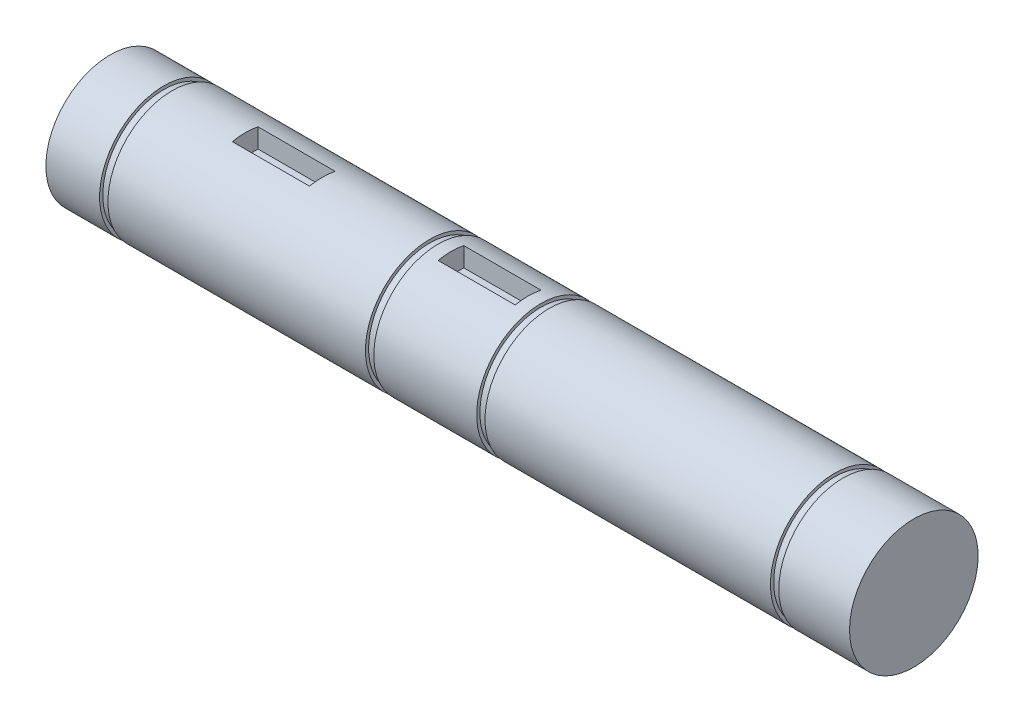
ISO-10303-21;
HEADER;
FILE_DESCRIPTION(('STEP AP214'),'2;1');
FILE_NAME('part.step','',(''),(''),'','','');
FILE_SCHEMA(('AUTOMOTIVE_DESIGN { 1 0 10303 214 1 1 1 1 }'));
ENDSEC;
DATA;
#1=APPLICATION_CONTEXT('core data for automotive mechanical design processes');
#2=APPLICATION_PROTOCOL_DEFINITION('international standard','automotive_design',2000,#1);
#3=PRODUCT_CONTEXT('',#1,'mechanical');
#4=PRODUCT('Part','Part','',(#3));
#5=PRODUCT_RELATED_PRODUCT_CATEGORY('part','',(#4));
#6=PRODUCT_DEFINITION_FORMATION('','',#4);
#7=PRODUCT_DEFINITION_CONTEXT('part definition',#1,'design');
#8=PRODUCT_DEFINITION('design','',#6,#7);
#9=PRODUCT_DEFINITION_SHAPE('','',#8);
#10=(LENGTH_UNIT() NAMED_UNIT(*) SI_UNIT(.MILLI.,.METRE.));
#11=(NAMED_UNIT(*) PLANE_ANGLE_UNIT() SI_UNIT($,.RADIAN.));
#12=(NAMED_UNIT(*) SI_UNIT($,.STERADIAN.) SOLID_ANGLE_UNIT());
#13=UNCERTAINTY_MEASURE_WITH_UNIT(LENGTH_MEASURE(1.E-05),#10,'distance_accuracy_value','');
#14=(GEOMETRIC_REPRESENTATION_CONTEXT(3) GLOBAL_UNCERTAINTY_ASSIGNED_CONTEXT((#13)) GLOBAL_UNIT_ASSIGNED_CONTEXT((#10,
#11,#12)) REPRESENTATION_CONTEXT('',''));
#15=CARTESIAN_POINT('',(0.,0.,0.));
#16=DIRECTION('',(0.,0.,1.));
#17=DIRECTION('',(1.,0.,0.));
#18=AXIS2_PLACEMENT_3D('',#15,#16,#17);
#19=CARTESIAN_POINT('',(77.5,0.,0.));
#20=DIRECTION('',(-1.,0.,0.));
#21=DIRECTION('',(0.,0.,1.));
#22=AXIS2_PLACEMENT_3D('',#19,#20,#21);
#23=CYLINDRICAL_SURFACE('',#22,10.);
#24=CARTESIAN_POINT('',(36.5,0.,0.));
#25=DIRECTION('',(1.,0.,0.));
#26=DIRECTION('',(0.,0.,-1.));
#27=AXIS2_PLACEMENT_3D('',#24,#25,#26);
#28=CIRCLE('',#27,10.);
#29=CARTESIAN_POINT('',(36.5,0.,-10.));
#30=VERTEX_POINT('',#29);
#31=EDGE_CURVE('E266',#30,#30,#28,.T.);
#32=ORIENTED_EDGE('',*,*,#31,.T.);
#33=EDGE_LOOP('',(#32));
#34=FACE_BOUND('',#33,.T.);
#35=CARTESIAN_POINT('',(47.5,0.,0.));
#36=DIRECTION('',(-1.,0.,0.));
#37=DIRECTION('',(0.,0.,1.));
#38=AXIS2_PLACEMENT_3D('',#35,#36,#37);
#39=CIRCLE('',#38,10.);
#40=CARTESIAN_POINT('',(47.5,0.,10.));
#41=VERTEX_POINT('',#40);
#42=EDGE_CURVE('E11',#41,#41,#39,.T.);
#43=ORIENTED_EDGE('',*,*,#42,.T.);
#44=EDGE_LOOP('',(#43));
#45=FACE_BOUND('',#44,.T.);
#46=ADVANCED_FACE('F40',(#34,#45),#23,.T.);
#47=CARTESIAN_POINT('',(35.2,10.,0.));
#48=DIRECTION('',(-1.,0.,0.));
#49=DIRECTION('',(0.,0.,1.));
#50=AXIS2_PLACEMENT_3D('',#47,#48,#49);
#51=PLANE('',#50);
#52=CARTESIAN_POINT('',(35.2,0.,0.));
#53=DIRECTION('',(1.,0.,0.));
#54=DIRECTION('',(0.,0.,-1.));
#55=AXIS2_PLACEMENT_3D('',#52,#53,#54);
#56=CIRCLE('',#55,9.5);
#57=CARTESIAN_POINT('',(35.2,0.,-9.5));
#58=VERTEX_POINT('',#57);
#59=EDGE_CURVE('E294',#58,#58,#56,.T.);
#60=ORIENTED_EDGE('',*,*,#59,.F.);
#61=EDGE_LOOP('',(#60));
#62=FACE_BOUND('',#61,.T.);
#63=CARTESIAN_POINT('',(35.2,0.,0.));
#64=DIRECTION('',(1.,0.,0.));
#65=DIRECTION('',(0.,0.,-1.));
#66=AXIS2_PLACEMENT_3D('',#63,#64,#65);
#67=CIRCLE('',#66,10.);
#68=CARTESIAN_POINT('',(35.2,0.,-10.));
#69=VERTEX_POINT('',#68);
#70=EDGE_CURVE('E263',#69,#69,#67,.T.);
#71=ORIENTED_EDGE('',*,*,#70,.T.);
#72=EDGE_LOOP('',(#71));
#73=FACE_BOUND('',#72,.T.);
#74=ADVANCED_FACE('F197',(#62,#73),#51,.F.);
#75=CARTESIAN_POINT('',(36.5,10.,0.));
#76=DIRECTION('',(1.,0.,0.));
#77=DIRECTION('',(0.,0.,-1.));
#78=AXIS2_PLACEMENT_3D('',#75,#76,#77);
#79=PLANE('',#78);
#80=ORIENTED_EDGE('',*,*,#31,.F.);
#81=EDGE_LOOP('',(#80));
#82=FACE_BOUND('',#81,.T.);
#83=CARTESIAN_POINT('',(36.5,0.,0.));
#84=DIRECTION('',(1.,0.,0.));
#85=DIRECTION('',(0.,0.,-1.));
#86=AXIS2_PLACEMENT_3D('',#83,#84,#85);
#87=CIRCLE('',#86,9.5);
#88=CARTESIAN_POINT('',(36.5,0.,-9.5));
#89=VERTEX_POINT('',#88);
#90=EDGE_CURVE('E271',#89,#89,#87,.T.);
#91=ORIENTED_EDGE('',*,*,#90,.T.);
#92=EDGE_LOOP('',(#91));
#93=FACE_BOUND('',#92,.T.);
#94=ADVANCED_FACE('F204',(#82,#93),#79,.F.);
#95=CARTESIAN_POINT('',(0.,0.,0.));
#96=DIRECTION('',(1.,0.,0.));
#97=DIRECTION('',(0.,0.,-1.));
#98=AXIS2_PLACEMENT_3D('',#95,#96,#97);
#99=CYLINDRICAL_SURFACE('',#98,9.5);
#100=ORIENTED_EDGE('',*,*,#90,.F.);
#101=EDGE_LOOP('',(#100));
#102=FACE_BOUND('',#101,.T.);
#103=ORIENTED_EDGE('',*,*,#59,.T.);
#104=EDGE_LOOP('',(#103));
#105=FACE_BOUND('',#104,.T.);
#106=ADVANCED_FACE('F246',(#102,#105),#99,.T.);
#107=CARTESIAN_POINT('',(-9.20000000000001,0.,0.));
#108=DIRECTION('',(1.,0.,0.));
#109=DIRECTION('',(0.,0.,-1.));
#110=AXIS2_PLACEMENT_3D('',#107,#108,#109);
#111=CIRCLE('',#110,10.);
#112=CARTESIAN_POINT('',(-9.20000000000001,0.,-10.));
#113=VERTEX_POINT('',#112);
#114=EDGE_CURVE('E260',#113,#113,#111,.T.);
#115=ORIENTED_EDGE('',*,*,#114,.T.);
#116=EDGE_LOOP('',(#115));
#117=FACE_BOUND('',#116,.T.);
#118=ORIENTED_EDGE('',*,*,#70,.F.);
#119=EDGE_LOOP('',(#118));
#120=FACE_BOUND('',#119,.T.);
#121=ADVANCED_FACE('F212',(#117,#120),#23,.T.);
#122=CARTESIAN_POINT('',(-9.20000000000001,10.,0.));
#123=DIRECTION('',(1.,0.,0.));
#124=DIRECTION('',(0.,0.,-1.));
#125=AXIS2_PLACEMENT_3D('',#122,#123,#124);
#126=PLANE('',#125);
#127=ORIENTED_EDGE('',*,*,#114,.F.);
#128=EDGE_LOOP('',(#127));
#129=FACE_BOUND('',#128,.T.);
#130=CARTESIAN_POINT('',(-9.20000000000001,0.,0.));
#131=DIRECTION('',(1.,0.,0.));
#132=DIRECTION('',(0.,0.,-1.));
#133=AXIS2_PLACEMENT_3D('',#130,#131,#132);
#134=CIRCLE('',#133,9.5);
#135=CARTESIAN_POINT('',(-9.20000000000001,0.,-9.5));
#136=VERTEX_POINT('',#135);
#137=EDGE_CURVE('E277',#136,#136,#134,.T.);
#138=ORIENTED_EDGE('',*,*,#137,.T.);
#139=EDGE_LOOP('',(#138));
#140=FACE_BOUND('',#139,.T.);
#141=ADVANCED_FACE('F245',(#129,#140),#126,.F.);
#142=CARTESIAN_POINT('',(0.,0.,0.));
#143=DIRECTION('',(1.,0.,0.));
#144=DIRECTION('',(0.,0.,-1.));
#145=AXIS2_PLACEMENT_3D('',#142,#143,#144);
#146=CYLINDRICAL_SURFACE('',#145,9.5);
#147=ORIENTED_EDGE('',*,*,#137,.F.);
#148=EDGE_LOOP('',(#147));
#149=FACE_BOUND('',#148,.T.);
#150=CARTESIAN_POINT('',(-10.5,0.,0.));
#151=DIRECTION('',(1.,0.,0.));
#152=DIRECTION('',(0.,0.,-1.));
#153=AXIS2_PLACEMENT_3D('',#150,#151,#152);
#154=CIRCLE('',#153,9.5);
#155=CARTESIAN_POINT('',(-10.5,0.,-9.5));
#156=VERTEX_POINT('',#155);
#157=EDGE_CURVE('E269',#156,#156,#154,.T.);
#158=ORIENTED_EDGE('',*,*,#157,.T.);
#159=EDGE_LOOP('',(#158));
#160=FACE_BOUND('',#159,.T.);
#161=ADVANCED_FACE('F252',(#149,#160),#146,.T.);
#162=CARTESIAN_POINT('',(-10.5,10.,0.));
#163=DIRECTION('',(-1.,0.,0.));
#164=DIRECTION('',(0.,0.,1.));
#165=AXIS2_PLACEMENT_3D('',#162,#163,#164);
#166=PLANE('',#165);
#167=ORIENTED_EDGE('',*,*,#157,.F.);
#168=EDGE_LOOP('',(#167));
#169=FACE_BOUND('',#168,.T.);
#170=CARTESIAN_POINT('',(-10.5,0.,0.));
#171=DIRECTION('',(1.,0.,0.));
#172=DIRECTION('',(0.,0.,-1.));
#173=AXIS2_PLACEMENT_3D('',#170,#171,#172);
#174=CIRCLE('',#173,10.);
#175=CARTESIAN_POINT('',(-10.5,0.,-10.));
#176=VERTEX_POINT('',#175);
#177=EDGE_CURVE('E265',#176,#176,#174,.T.);
#178=ORIENTED_EDGE('',*,*,#177,.T.);
#179=EDGE_LOOP('',(#178));
#180=FACE_BOUND('',#179,.T.);
#181=ADVANCED_FACE('F337',(#169,#180),#166,.F.);
#182=CARTESIAN_POINT('',(0.,6.8,0.));
#183=DIRECTION('',(0.,-1.,0.));
#184=DIRECTION('',(0.,0.,-1.));
#185=AXIS2_PLACEMENT_3D('',#182,#183,#184);
#186=PLANE('',#185);
#187=DIRECTION('',(0.,0.,-1.));
#188=VECTOR('',#187,1.);
#189=CARTESIAN_POINT('',(-12.5,6.8,2.));
#190=LINE('',#189,#188);
#191=CARTESIAN_POINT('',(-12.5,6.8,2.));
#192=VERTEX_POINT('',#191);
#193=CARTESIAN_POINT('',(-12.5,6.8,-2.));
#194=VERTEX_POINT('',#193);
#195=EDGE_CURVE('E127',#192,#194,#190,.T.);
#196=ORIENTED_EDGE('',*,*,#195,.T.);
#197=DIRECTION('',(-1.,0.,0.));
#198=VECTOR('',#197,1.);
#199=CARTESIAN_POINT('',(-24.5,6.8,-2.));
#200=LINE('',#199,#198);
#201=CARTESIAN_POINT('',(-24.5,6.8,-2.));
#202=VERTEX_POINT('',#201);
#203=EDGE_CURVE('E130',#194,#202,#200,.T.);
#204=ORIENTED_EDGE('',*,*,#203,.T.);
#205=DIRECTION('',(0.,0.,1.));
#206=VECTOR('',#205,1.);
#207=CARTESIAN_POINT('',(-24.5,6.8,2.));
#208=LINE('',#207,#206);
#209=CARTESIAN_POINT('',(-24.5,6.8,2.));
#210=VERTEX_POINT('',#209);
#211=EDGE_CURVE('E158',#202,#210,#208,.T.);
#212=ORIENTED_EDGE('',*,*,#211,.T.);
#213=DIRECTION('',(1.,0.,0.));
#214=VECTOR('',#213,1.);
#215=CARTESIAN_POINT('',(-24.5,6.8,2.));
#216=LINE('',#215,#214);
#217=EDGE_CURVE('E147',#210,#192,#216,.T.);
#218=ORIENTED_EDGE('',*,*,#217,.T.);
#219=EDGE_LOOP('',(#196,#204,#212,#218));
#220=FACE_BOUND('',#219,.T.);
#221=ADVANCED_FACE('F330',(#220),#186,.F.);
#222=CARTESIAN_POINT('',(-12.5,6.8,2.));
#223=DIRECTION('',(1.,0.,0.));
#224=DIRECTION('',(0.,0.,-1.));
#225=AXIS2_PLACEMENT_3D('',#222,#223,#224);
#226=PLANE('',#225);
#227=DIRECTION('',(0.,1.,0.));
#228=VECTOR('',#227,1.);
#229=CARTESIAN_POINT('',(-12.5,6.8,-2.));
#230=LINE('',#229,#228);
#231=CARTESIAN_POINT('',(-12.5,9.79795897113271,-2.));
#232=VERTEX_POINT('',#231);
#233=EDGE_CURVE('E145',#194,#232,#230,.T.);
#234=ORIENTED_EDGE('',*,*,#233,.F.);
#235=ORIENTED_EDGE('',*,*,#195,.F.);
#236=DIRECTION('',(0.,1.,0.));
#237=VECTOR('',#236,1.);
#238=CARTESIAN_POINT('',(-12.5,6.8,2.));
#239=LINE('',#238,#237);
#240=CARTESIAN_POINT('',(-12.5,9.79795897113271,2.));
#241=VERTEX_POINT('',#240);
#242=EDGE_CURVE('E154',#192,#241,#239,.T.);
#243=ORIENTED_EDGE('',*,*,#242,.T.);
#244=CARTESIAN_POINT('',(-12.5,0.,0.));
#245=DIRECTION('',(1.,0.,0.));
#246=DIRECTION('',(0.,0.,-1.));
#247=AXIS2_PLACEMENT_3D('',#244,#245,#246);
#248=CIRCLE('',#247,10.);
#249=EDGE_CURVE('E63',#232,#241,#248,.T.);
#250=ORIENTED_EDGE('',*,*,#249,.F.);
#251=EDGE_LOOP('',(#234,#235,#243,#250));
#252=FACE_BOUND('',#251,.T.);
#253=ADVANCED_FACE('F326',(#252),#226,.F.);
#254=CARTESIAN_POINT('',(-24.5,6.8,-2.));
#255=DIRECTION('',(0.,0.,-1.));
#256=DIRECTION('',(-1.,0.,0.));
#257=AXIS2_PLACEMENT_3D('',#254,#255,#256);
#258=PLANE('',#257);
#259=DIRECTION('',(0.,1.,0.));
#260=VECTOR('',#259,1.);
#261=CARTESIAN_POINT('',(-24.5,6.8,-2.));
#262=LINE('',#261,#260);
#263=CARTESIAN_POINT('',(-24.5,9.79795897113271,-2.));
#264=VERTEX_POINT('',#263);
#265=EDGE_CURVE('E148',#202,#264,#262,.T.);
#266=ORIENTED_EDGE('',*,*,#265,.F.);
#267=ORIENTED_EDGE('',*,*,#203,.F.);
#268=ORIENTED_EDGE('',*,*,#233,.T.);
#269=DIRECTION('',(-1.,0.,0.));
#270=VECTOR('',#269,1.);
#271=CARTESIAN_POINT('',(77.5,9.79795897113271,-2.));
#272=LINE('',#271,#270);
#273=EDGE_CURVE('E169',#264,#232,#272,.F.);
#274=ORIENTED_EDGE('',*,*,#273,.F.);
#275=EDGE_LOOP('',(#266,#267,#268,#274));
#276=FACE_BOUND('',#275,.T.);
#277=ADVANCED_FACE('F329',(#276),#258,.F.);
#278=CARTESIAN_POINT('',(-24.5,6.8,2.));
#279=DIRECTION('',(-1.,0.,0.));
#280=DIRECTION('',(0.,0.,1.));
#281=AXIS2_PLACEMENT_3D('',#278,#279,#280);
#282=PLANE('',#281);
#283=DIRECTION('',(0.,1.,0.));
#284=VECTOR('',#283,1.);
#285=CARTESIAN_POINT('',(-24.5,6.8,2.));
#286=LINE('',#285,#284);
#287=CARTESIAN_POINT('',(-24.5,9.79795897113271,2.));
#288=VERTEX_POINT('',#287);
#289=EDGE_CURVE('E151',#210,#288,#286,.T.);
#290=ORIENTED_EDGE('',*,*,#289,.F.);
#291=ORIENTED_EDGE('',*,*,#211,.F.);
#292=ORIENTED_EDGE('',*,*,#265,.T.);
#293=CARTESIAN_POINT('',(-24.5,0.,0.));
#294=DIRECTION('',(-1.,0.,0.));
#295=DIRECTION('',(0.,0.,1.));
#296=AXIS2_PLACEMENT_3D('',#293,#294,#295);
#297=CIRCLE('',#296,10.);
#298=EDGE_CURVE('E165',#288,#264,#297,.T.);
#299=ORIENTED_EDGE('',*,*,#298,.F.);
#300=EDGE_LOOP('',(#290,#291,#292,#299));
#301=FACE_BOUND('',#300,.T.);
#302=ADVANCED_FACE('F239',(#301),#282,.F.);
#303=CARTESIAN_POINT('',(-24.5,6.8,2.));
#304=DIRECTION('',(0.,0.,1.));
#305=DIRECTION('',(1.,0.,0.));
#306=AXIS2_PLACEMENT_3D('',#303,#304,#305);
#307=PLANE('',#306);
#308=ORIENTED_EDGE('',*,*,#242,.F.);
#309=ORIENTED_EDGE('',*,*,#217,.F.);
#310=ORIENTED_EDGE('',*,*,#289,.T.);
#311=DIRECTION('',(-1.,0.,0.));
#312=VECTOR('',#311,1.);
#313=CARTESIAN_POINT('',(77.5,9.79795897113271,2.));
#314=LINE('',#313,#312);
#315=EDGE_CURVE('E172',#241,#288,#314,.T.);
#316=ORIENTED_EDGE('',*,*,#315,.F.);
#317=EDGE_LOOP('',(#308,#309,#310,#316));
#318=FACE_BOUND('',#317,.T.);
#319=ADVANCED_FACE('F229',(#318),#307,.F.);
#320=ORIENTED_EDGE('',*,*,#177,.F.);
#321=EDGE_LOOP('',(#320));
#322=FACE_BOUND('',#321,.T.);
#323=ORIENTED_EDGE('',*,*,#315,.T.);
#324=ORIENTED_EDGE('',*,*,#298,.T.);
#325=ORIENTED_EDGE('',*,*,#273,.T.);
#326=ORIENTED_EDGE('',*,*,#249,.T.);
#327=EDGE_LOOP('',(#323,#324,#325,#326));
#328=FACE_BOUND('',#327,.T.);
#329=CARTESIAN_POINT('',(-26.5,0.,0.));
#330=DIRECTION('',(1.,0.,0.));
#331=DIRECTION('',(0.,0.,-1.));
#332=AXIS2_PLACEMENT_3D('',#329,#330,#331);
#333=CIRCLE('',#332,10.);
#334=CARTESIAN_POINT('',(-26.5,0.,-10.));
#335=VERTEX_POINT('',#334);
#336=EDGE_CURVE('E281',#335,#335,#333,.T.);
#337=ORIENTED_EDGE('',*,*,#336,.T.);
#338=EDGE_LOOP('',(#337));
#339=FACE_BOUND('',#338,.T.);
#340=ADVANCED_FACE('F216',(#322,#328,#339),#23,.T.);
#341=CARTESIAN_POINT('',(-26.5,10.,0.));
#342=DIRECTION('',(1.,0.,0.));
#343=DIRECTION('',(0.,0.,-1.));
#344=AXIS2_PLACEMENT_3D('',#341,#342,#343);
#345=PLANE('',#344);
#346=ORIENTED_EDGE('',*,*,#336,.F.);
#347=EDGE_LOOP('',(#346));
#348=FACE_BOUND('',#347,.T.);
#349=CARTESIAN_POINT('',(-26.5,0.,0.));
#350=DIRECTION('',(1.,0.,0.));
#351=DIRECTION('',(0.,0.,-1.));
#352=AXIS2_PLACEMENT_3D('',#349,#350,#351);
#353=CIRCLE('',#352,9.5);
#354=CARTESIAN_POINT('',(-26.5,0.,-9.5));
#355=VERTEX_POINT('',#354);
#356=EDGE_CURVE('E133',#355,#355,#353,.T.);
#357=ORIENTED_EDGE('',*,*,#356,.T.);
#358=EDGE_LOOP('',(#357));
#359=FACE_BOUND('',#358,.T.);
#360=ADVANCED_FACE('F228',(#348,#359),#345,.F.);
#361=CARTESIAN_POINT('',(0.,0.,0.));
#362=DIRECTION('',(1.,0.,0.));
#363=DIRECTION('',(0.,0.,-1.));
#364=AXIS2_PLACEMENT_3D('',#361,#362,#363);
#365=CYLINDRICAL_SURFACE('',#364,9.5);
#366=ORIENTED_EDGE('',*,*,#356,.F.);
#367=EDGE_LOOP('',(#366));
#368=FACE_BOUND('',#367,.T.);
#369=CARTESIAN_POINT('',(-27.8,0.,0.));
#370=DIRECTION('',(1.,0.,0.));
#371=DIRECTION('',(0.,0.,-1.));
#372=AXIS2_PLACEMENT_3D('',#369,#370,#371);
#373=CIRCLE('',#372,9.5);
#374=CARTESIAN_POINT('',(-27.8,0.,-9.5));
#375=VERTEX_POINT('',#374);
#376=EDGE_CURVE('E299',#375,#375,#373,.T.);
#377=ORIENTED_EDGE('',*,*,#376,.T.);
#378=EDGE_LOOP('',(#377));
#379=FACE_BOUND('',#378,.T.);
#380=ADVANCED_FACE('F235',(#368,#379),#365,.T.);
#381=CARTESIAN_POINT('',(-27.8,10.,0.));
#382=DIRECTION('',(-1.,0.,0.));
#383=DIRECTION('',(0.,0.,1.));
#384=AXIS2_PLACEMENT_3D('',#381,#382,#383);
#385=PLANE('',#384);
#386=ORIENTED_EDGE('',*,*,#376,.F.);
#387=EDGE_LOOP('',(#386));
#388=FACE_BOUND('',#387,.T.);
#389=CARTESIAN_POINT('',(-27.8,0.,0.));
#390=DIRECTION('',(1.,0.,0.));
#391=DIRECTION('',(0.,0.,-1.));
#392=AXIS2_PLACEMENT_3D('',#389,#390,#391);
#393=CIRCLE('',#392,10.);
#394=CARTESIAN_POINT('',(-27.8,0.,-10.));
#395=VERTEX_POINT('',#394);
#396=EDGE_CURVE('E297',#395,#395,#393,.T.);
#397=ORIENTED_EDGE('',*,*,#396,.T.);
#398=EDGE_LOOP('',(#397));
#399=FACE_BOUND('',#398,.T.);
#400=ADVANCED_FACE('F308',(#388,#399),#385,.F.);
#401=CARTESIAN_POINT('',(0.,6.8,0.));
#402=DIRECTION('',(0.,-1.,0.));
#403=DIRECTION('',(0.,0.,-1.));
#404=AXIS2_PLACEMENT_3D('',#401,#402,#403);
#405=PLANE('',#404);
#406=DIRECTION('',(0.,0.,-1.));
#407=VECTOR('',#406,1.);
#408=CARTESIAN_POINT('',(-44.5,6.8,2.));
#409=LINE('',#408,#407);
#410=CARTESIAN_POINT('',(-44.5,6.8,2.));
#411=VERTEX_POINT('',#410);
#412=CARTESIAN_POINT('',(-44.5,6.8,-2.));
#413=VERTEX_POINT('',#412);
#414=EDGE_CURVE('E109',#411,#413,#409,.T.);
#415=ORIENTED_EDGE('',*,*,#414,.T.);
#416=DIRECTION('',(-1.,0.,0.));
#417=VECTOR('',#416,1.);
#418=CARTESIAN_POINT('',(-56.5,6.8,-2.));
#419=LINE('',#418,#417);
#420=CARTESIAN_POINT('',(-56.5,6.8,-2.));
#421=VERTEX_POINT('',#420);
#422=EDGE_CURVE('E117',#413,#421,#419,.T.);
#423=ORIENTED_EDGE('',*,*,#422,.T.);
#424=DIRECTION('',(0.,0.,1.));
#425=VECTOR('',#424,1.);
#426=CARTESIAN_POINT('',(-56.5,6.8,2.));
#427=LINE('',#426,#425);
#428=CARTESIAN_POINT('',(-56.5,6.8,2.));
#429=VERTEX_POINT('',#428);
#430=EDGE_CURVE('E123',#421,#429,#427,.T.);
#431=ORIENTED_EDGE('',*,*,#430,.T.);
#432=DIRECTION('',(1.,0.,0.));
#433=VECTOR('',#432,1.);
#434=CARTESIAN_POINT('',(-56.5,6.8,2.));
#435=LINE('',#434,#433);
#436=EDGE_CURVE('E114',#429,#411,#435,.T.);
#437=ORIENTED_EDGE('',*,*,#436,.T.);
#438=EDGE_LOOP('',(#415,#423,#431,#437));
#439=FACE_BOUND('',#438,.T.);
#440=ADVANCED_FACE('F125',(#439),#405,.F.);
#441=CARTESIAN_POINT('',(-44.5,6.8,2.));
#442=DIRECTION('',(1.,0.,0.));
#443=DIRECTION('',(0.,0.,-1.));
#444=AXIS2_PLACEMENT_3D('',#441,#442,#443);
#445=PLANE('',#444);
#446=DIRECTION('',(0.,1.,0.));
#447=VECTOR('',#446,1.);
#448=CARTESIAN_POINT('',(-44.5,6.8,-2.));
#449=LINE('',#448,#447);
#450=CARTESIAN_POINT('',(-44.5,9.79795897113271,-2.));
#451=VERTEX_POINT('',#450);
#452=EDGE_CURVE('E105',#413,#451,#449,.T.);
#453=ORIENTED_EDGE('',*,*,#452,.F.);
#454=ORIENTED_EDGE('',*,*,#414,.F.);
#455=DIRECTION('',(0.,1.,0.));
#456=VECTOR('',#455,1.);
#457=CARTESIAN_POINT('',(-44.5,6.8,2.));
#458=LINE('',#457,#456);
#459=CARTESIAN_POINT('',(-44.5,9.79795897113271,2.));
#460=VERTEX_POINT('',#459);
#461=EDGE_CURVE('E138',#411,#460,#458,.T.);
#462=ORIENTED_EDGE('',*,*,#461,.T.);
#463=CARTESIAN_POINT('',(-44.5,0.,0.));
#464=DIRECTION('',(1.,0.,0.));
#465=DIRECTION('',(0.,0.,-1.));
#466=AXIS2_PLACEMENT_3D('',#463,#464,#465);
#467=CIRCLE('',#466,10.);
#468=EDGE_CURVE('E55',#451,#460,#467,.T.);
#469=ORIENTED_EDGE('',*,*,#468,.F.);
#470=EDGE_LOOP('',(#453,#454,#462,#469));
#471=FACE_BOUND('',#470,.T.);
#472=ADVANCED_FACE('F107',(#471),#445,.F.);
#473=CARTESIAN_POINT('',(-56.5,6.8,-2.));
#474=DIRECTION('',(0.,0.,-1.));
#475=DIRECTION('',(-1.,0.,0.));
#476=AXIS2_PLACEMENT_3D('',#473,#474,#475);
#477=PLANE('',#476);
#478=DIRECTION('',(0.,1.,0.));
#479=VECTOR('',#478,1.);
#480=CARTESIAN_POINT('',(-56.5,6.8,-2.));
#481=LINE('',#480,#479);
#482=CARTESIAN_POINT('',(-56.5,9.79795897113271,-2.));
#483=VERTEX_POINT('',#482);
#484=EDGE_CURVE('E113',#421,#483,#481,.T.);
#485=ORIENTED_EDGE('',*,*,#484,.F.);
#486=ORIENTED_EDGE('',*,*,#422,.F.);
#487=ORIENTED_EDGE('',*,*,#452,.T.);
#488=DIRECTION('',(-1.,0.,0.));
#489=VECTOR('',#488,1.);
#490=CARTESIAN_POINT('',(77.5,9.79795897113271,-2.));
#491=LINE('',#490,#489);
#492=EDGE_CURVE('E179',#483,#451,#491,.F.);
#493=ORIENTED_EDGE('',*,*,#492,.F.);
#494=EDGE_LOOP('',(#485,#486,#487,#493));
#495=FACE_BOUND('',#494,.T.);
#496=ADVANCED_FACE('F118',(#495),#477,.F.);
#497=CARTESIAN_POINT('',(-56.5,6.8,2.));
#498=DIRECTION('',(-1.,0.,0.));
#499=DIRECTION('',(0.,0.,1.));
#500=AXIS2_PLACEMENT_3D('',#497,#498,#499);
#501=PLANE('',#500);
#502=DIRECTION('',(0.,1.,0.));
#503=VECTOR('',#502,1.);
#504=CARTESIAN_POINT('',(-56.5,6.8,2.));
#505=LINE('',#504,#503);
#506=CARTESIAN_POINT('',(-56.5,9.79795897113271,2.));
#507=VERTEX_POINT('',#506);
#508=EDGE_CURVE('E141',#429,#507,#505,.T.);
#509=ORIENTED_EDGE('',*,*,#508,.F.);
#510=ORIENTED_EDGE('',*,*,#430,.F.);
#511=ORIENTED_EDGE('',*,*,#484,.T.);
#512=CARTESIAN_POINT('',(-56.5,0.,0.));
#513=DIRECTION('',(-1.,0.,0.));
#514=DIRECTION('',(0.,0.,1.));
#515=AXIS2_PLACEMENT_3D('',#512,#513,#514);
#516=CIRCLE('',#515,10.);
#517=EDGE_CURVE('E175',#507,#483,#516,.T.);
#518=ORIENTED_EDGE('',*,*,#517,.F.);
#519=EDGE_LOOP('',(#509,#510,#511,#518));
#520=FACE_BOUND('',#519,.T.);
#521=ADVANCED_FACE('F187',(#520),#501,.F.);
#522=CARTESIAN_POINT('',(-56.5,6.8,2.));
#523=DIRECTION('',(0.,0.,1.));
#524=DIRECTION('',(1.,0.,0.));
#525=AXIS2_PLACEMENT_3D('',#522,#523,#524);
#526=PLANE('',#525);
#527=ORIENTED_EDGE('',*,*,#461,.F.);
#528=ORIENTED_EDGE('',*,*,#436,.F.);
#529=ORIENTED_EDGE('',*,*,#508,.T.);
#530=DIRECTION('',(-1.,0.,0.));
#531=VECTOR('',#530,1.);
#532=CARTESIAN_POINT('',(77.5,9.79795897113271,2.));
#533=LINE('',#532,#531);
#534=EDGE_CURVE('E48',#460,#507,#533,.T.);
#535=ORIENTED_EDGE('',*,*,#534,.F.);
#536=EDGE_LOOP('',(#527,#528,#529,#535));
#537=FACE_BOUND('',#536,.T.);
#538=ADVANCED_FACE('F185',(#537),#526,.F.);
#539=CARTESIAN_POINT('',(-67.85,0.,0.));
#540=DIRECTION('',(1.,0.,0.));
#541=DIRECTION('',(0.,0.,-1.));
#542=AXIS2_PLACEMENT_3D('',#539,#540,#541);
#543=CIRCLE('',#542,10.);
#544=CARTESIAN_POINT('',(-67.85,0.,-10.));
#545=VERTEX_POINT('',#544);
#546=EDGE_CURVE('E291',#545,#545,#543,.T.);
#547=ORIENTED_EDGE('',*,*,#546,.T.);
#548=EDGE_LOOP('',(#547));
#549=FACE_BOUND('',#548,.T.);
#550=ORIENTED_EDGE('',*,*,#534,.T.);
#551=ORIENTED_EDGE('',*,*,#517,.T.);
#552=ORIENTED_EDGE('',*,*,#492,.T.);
#553=ORIENTED_EDGE('',*,*,#468,.T.);
#554=EDGE_LOOP('',(#550,#551,#552,#553));
#555=FACE_BOUND('',#554,.T.);
#556=ORIENTED_EDGE('',*,*,#396,.F.);
#557=EDGE_LOOP('',(#556));
#558=FACE_BOUND('',#557,.T.);
#559=ADVANCED_FACE('F182',(#549,#555,#558),#23,.T.);
#560=CARTESIAN_POINT('',(-67.85,10.,0.));
#561=DIRECTION('',(1.,0.,0.));
#562=DIRECTION('',(0.,0.,-1.));
#563=AXIS2_PLACEMENT_3D('',#560,#561,#562);
#564=PLANE('',#563);
#565=ORIENTED_EDGE('',*,*,#546,.F.);
#566=EDGE_LOOP('',(#565));
#567=FACE_BOUND('',#566,.T.);
#568=CARTESIAN_POINT('',(-67.85,0.,0.));
#569=DIRECTION('',(1.,0.,0.));
#570=DIRECTION('',(0.,0.,-1.));
#571=AXIS2_PLACEMENT_3D('',#568,#569,#570);
#572=CIRCLE('',#571,9.49999999999999);
#573=CARTESIAN_POINT('',(-67.85,0.,-9.49999999999999));
#574=VERTEX_POINT('',#573);
#575=EDGE_CURVE('E282',#574,#574,#572,.T.);
#576=ORIENTED_EDGE('',*,*,#575,.T.);
#577=EDGE_LOOP('',(#576));
#578=FACE_BOUND('',#577,.T.);
#579=ADVANCED_FACE('F210',(#567,#578),#564,.F.);
#580=CARTESIAN_POINT('',(-69.15,10.,0.));
#581=DIRECTION('',(-1.,0.,0.));
#582=DIRECTION('',(0.,0.,1.));
#583=AXIS2_PLACEMENT_3D('',#580,#581,#582);
#584=PLANE('',#583);
#585=CARTESIAN_POINT('',(-69.15,0.,0.));
#586=DIRECTION('',(1.,0.,0.));
#587=DIRECTION('',(0.,0.,-1.));
#588=AXIS2_PLACEMENT_3D('',#585,#586,#587);
#589=CIRCLE('',#588,9.49999999999999);
#590=CARTESIAN_POINT('',(-69.15,0.,-9.49999999999999));
#591=VERTEX_POINT('',#590);
#592=EDGE_CURVE('E285',#591,#591,#589,.T.);
#593=ORIENTED_EDGE('',*,*,#592,.F.);
#594=EDGE_LOOP('',(#593));
#595=FACE_BOUND('',#594,.T.);
#596=CARTESIAN_POINT('',(-69.15,0.,0.));
#597=DIRECTION('',(1.,0.,0.));
#598=DIRECTION('',(0.,0.,-1.));
#599=AXIS2_PLACEMENT_3D('',#596,#597,#598);
#600=CIRCLE('',#599,10.);
#601=CARTESIAN_POINT('',(-69.15,0.,-10.));
#602=VERTEX_POINT('',#601);
#603=EDGE_CURVE('E288',#602,#602,#600,.T.);
#604=ORIENTED_EDGE('',*,*,#603,.T.);
#605=EDGE_LOOP('',(#604));
#606=FACE_BOUND('',#605,.T.);
#607=ADVANCED_FACE('F359',(#595,#606),#584,.F.);
#608=CARTESIAN_POINT('',(0.,0.,0.));
#609=DIRECTION('',(1.,0.,0.));
#610=DIRECTION('',(0.,0.,-1.));
#611=AXIS2_PLACEMENT_3D('',#608,#609,#610);
#612=CYLINDRICAL_SURFACE('',#611,9.49999999999999);
#613=ORIENTED_EDGE('',*,*,#575,.F.);
#614=EDGE_LOOP('',(#613));
#615=FACE_BOUND('',#614,.T.);
#616=ORIENTED_EDGE('',*,*,#592,.T.);
#617=EDGE_LOOP('',(#616));
#618=FACE_BOUND('',#617,.T.);
#619=ADVANCED_FACE('F223',(#615,#618),#612,.T.);
#620=CARTESIAN_POINT('',(-77.5,0.,0.));
#621=DIRECTION('',(1.,0.,0.));
#622=DIRECTION('',(0.,0.,-1.));
#623=AXIS2_PLACEMENT_3D('',#620,#621,#622);
#624=PLANE('',#623);
#625=CARTESIAN_POINT('',(-77.5,0.,0.));
#626=DIRECTION('',(1.,0.,0.));
#627=DIRECTION('',(0.,0.,-1.));
#628=AXIS2_PLACEMENT_3D('',#625,#626,#627);
#629=CIRCLE('',#628,10.);
#630=CARTESIAN_POINT('',(-77.5,0.,-10.));
#631=VERTEX_POINT('',#630);
#632=EDGE_CURVE('E140',#631,#631,#629,.T.);
#633=ORIENTED_EDGE('',*,*,#632,.F.);
#634=EDGE_LOOP('',(#633));
#635=FACE_BOUND('',#634,.T.);
#636=ADVANCED_FACE('F214',(#635),#624,.F.);
#637=ORIENTED_EDGE('',*,*,#603,.F.);
#638=EDGE_LOOP('',(#637));
#639=FACE_BOUND('',#638,.T.);
#640=ORIENTED_EDGE('',*,*,#632,.T.);
#641=EDGE_LOOP('',(#640));
#642=FACE_BOUND('',#641,.T.);
#643=ADVANCED_FACE('F42',(#639,#642),#23,.T.);
#644=CARTESIAN_POINT('',(47.5,-10.,-9.99999999999999));
#645=DIRECTION('',(-1.,0.,0.));
#646=DIRECTION('',(0.,0.,1.));
#647=AXIS2_PLACEMENT_3D('',#644,#645,#646);
#648=PLANE('',#647);
#649=ORIENTED_EDGE('',*,*,#42,.F.);
#650=EDGE_LOOP('',(#649));
#651=FACE_BOUND('',#650,.T.);
#652=ADVANCED_FACE('F213',(#651),#648,.F.);
#653=CLOSED_SHELL('',(#46,#74,#94,#106,#121,#141,#161,#181,#221,#253,#277,#302,#319,#340,#360,
#380,#400,#440,#472,#496,#521,#538,#559,#579,#607,#619,#636,#643,#652));
#654=MANIFOLD_SOLID_BREP('B2',#653);
#655=ADVANCED_BREP_SHAPE_REPRESENTATION('',(#18,#654),#14);
#656=SHAPE_DEFINITION_REPRESENTATION(#9,#655);
ENDSEC;
END-ISO-10303-21;
